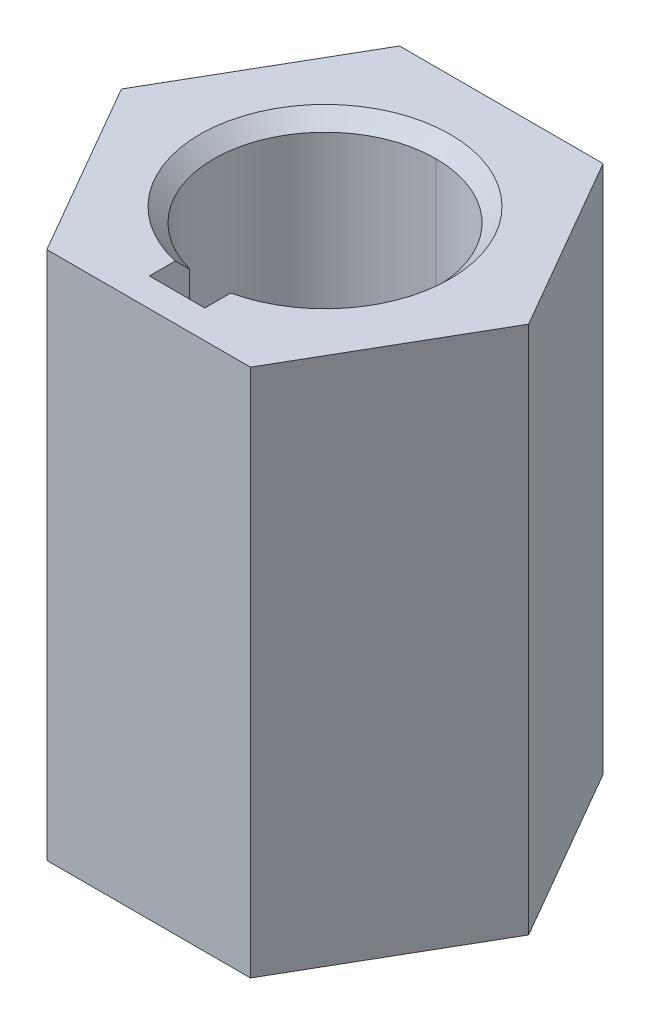
ISO-10303-21;
HEADER;
FILE_DESCRIPTION(('STEP AP214'),'2;1');
FILE_NAME('part.step','',(''),(''),'','','');
FILE_SCHEMA(('AUTOMOTIVE_DESIGN { 1 0 10303 214 1 1 1 1 }'));
ENDSEC;
DATA;
#1=APPLICATION_CONTEXT('core data for automotive mechanical design processes');
#2=APPLICATION_PROTOCOL_DEFINITION('international standard','automotive_design',2000,#1);
#3=PRODUCT_CONTEXT('',#1,'mechanical');
#4=PRODUCT('Part','Part','',(#3));
#5=PRODUCT_RELATED_PRODUCT_CATEGORY('part','',(#4));
#6=PRODUCT_DEFINITION_FORMATION('','',#4);
#7=PRODUCT_DEFINITION_CONTEXT('part definition',#1,'design');
#8=PRODUCT_DEFINITION('design','',#6,#7);
#9=PRODUCT_DEFINITION_SHAPE('','',#8);
#10=(LENGTH_UNIT() NAMED_UNIT(*) SI_UNIT(.MILLI.,.METRE.));
#11=(NAMED_UNIT(*) PLANE_ANGLE_UNIT() SI_UNIT($,.RADIAN.));
#12=(NAMED_UNIT(*) SI_UNIT($,.STERADIAN.) SOLID_ANGLE_UNIT());
#13=UNCERTAINTY_MEASURE_WITH_UNIT(LENGTH_MEASURE(1.E-05),#10,'distance_accuracy_value','');
#14=(GEOMETRIC_REPRESENTATION_CONTEXT(3) GLOBAL_UNCERTAINTY_ASSIGNED_CONTEXT((#13)) GLOBAL_UNIT_ASSIGNED_CONTEXT((#10,
#11,#12)) REPRESENTATION_CONTEXT('',''));
#15=CARTESIAN_POINT('',(0.,0.,0.));
#16=DIRECTION('',(0.,0.,1.));
#17=DIRECTION('',(1.,0.,0.));
#18=AXIS2_PLACEMENT_3D('',#15,#16,#17);
#19=CARTESIAN_POINT('',(0.,0.,0.));
#20=DIRECTION('',(0.,-1.,0.));
#21=DIRECTION('',(0.,0.,-1.));
#22=AXIS2_PLACEMENT_3D('',#19,#20,#21);
#23=CONICAL_SURFACE('',#22,4.508,0.785398163397443);
#24=CARTESIAN_POINT('',(0.,0.508,0.));
#25=DIRECTION('',(0.,-1.,0.));
#26=DIRECTION('',(0.,0.,1.));
#27=AXIS2_PLACEMENT_3D('',#24,#25,#26);
#28=CIRCLE('',#27,4.);
#29=CARTESIAN_POINT('',(0.,0.508,-4.));
#30=VERTEX_POINT('',#29);
#31=CARTESIAN_POINT('',(1.,0.508,3.87298334620742));
#32=VERTEX_POINT('',#31);
#33=EDGE_CURVE('E41',#30,#32,#28,.T.);
#34=ORIENTED_EDGE('',*,*,#33,.F.);
#35=DIRECTION('',(0.,-0.707106781186551,-0.707106781186544));
#36=VECTOR('',#35,1.);
#37=CARTESIAN_POINT('',(0.,0.,-4.508));
#38=LINE('',#37,#36);
#39=CARTESIAN_POINT('',(0.,0.,-4.508));
#40=VERTEX_POINT('',#39);
#41=EDGE_CURVE('E11',#30,#40,#38,.T.);
#42=ORIENTED_EDGE('',*,*,#41,.T.);
#43=CARTESIAN_POINT('',(0.,0.,0.));
#44=DIRECTION('',(0.,1.,0.));
#45=DIRECTION('',(0.,0.,1.));
#46=AXIS2_PLACEMENT_3D('',#43,#44,#45);
#47=CIRCLE('',#46,4.508);
#48=CARTESIAN_POINT('',(1.,0.,4.39568697702645));
#49=VERTEX_POINT('',#48);
#50=EDGE_CURVE('E220',#49,#40,#47,.T.);
#51=ORIENTED_EDGE('',*,*,#50,.F.);
#52=CARTESIAN_POINT('',(1.,0.508,3.87298334620742));
#53=CARTESIAN_POINT('',(1.,0.338992287878547,4.04753376072128));
#54=CARTESIAN_POINT('',(1.,0.169620782890584,4.22173225885223));
#55=CARTESIAN_POINT('',(1.,0.,4.39568697702645));
#56=(BOUNDED_CURVE() B_SPLINE_CURVE(3,(#52,#53,#54,#55),.UNSPECIFIED.,.F.,
.F.) B_SPLINE_CURVE_WITH_KNOTS((4,4),(0.,0.000728891683085627),
.UNSPECIFIED.) CURVE() GEOMETRIC_REPRESENTATION_ITEM() RATIONAL_B_SPLINE_CURVE((1.,1.,1.,1.)) REPRESENTATION_ITEM(''));
#57=EDGE_CURVE('E166',#32,#49,#56,.T.);
#58=ORIENTED_EDGE('',*,*,#57,.F.);
#59=EDGE_LOOP('',(#34,#42,#51,#58));
#60=FACE_BOUND('',#59,.T.);
#61=ADVANCED_FACE('F16',(#60),#23,.F.);
#62=CARTESIAN_POINT('',(0.,19.05,0.));
#63=DIRECTION('',(0.,-1.,0.));
#64=DIRECTION('',(0.,0.,-1.));
#65=AXIS2_PLACEMENT_3D('',#62,#63,#64);
#66=CYLINDRICAL_SURFACE('',#65,4.);
#67=CARTESIAN_POINT('',(0.,18.542,0.));
#68=DIRECTION('',(0.,1.,0.));
#69=DIRECTION('',(0.,0.,1.));
#70=AXIS2_PLACEMENT_3D('',#67,#68,#69);
#71=CIRCLE('',#70,4.);
#72=CARTESIAN_POINT('',(1.,18.542,3.87298334620742));
#73=VERTEX_POINT('',#72);
#74=CARTESIAN_POINT('',(0.,18.542,-4.));
#75=VERTEX_POINT('',#74);
#76=EDGE_CURVE('E27',#73,#75,#71,.T.);
#77=ORIENTED_EDGE('',*,*,#76,.T.);
#78=DIRECTION('',(0.,-1.,0.));
#79=VECTOR('',#78,1.);
#80=CARTESIAN_POINT('',(0.,19.05,-4.));
#81=LINE('',#80,#79);
#82=EDGE_CURVE('E177',#75,#30,#81,.T.);
#83=ORIENTED_EDGE('',*,*,#82,.T.);
#84=ORIENTED_EDGE('',*,*,#33,.T.);
#85=DIRECTION('',(0.,-1.,0.));
#86=VECTOR('',#85,1.);
#87=CARTESIAN_POINT('',(1.,19.05,3.87298334620742));
#88=LINE('',#87,#86);
#89=EDGE_CURVE('E159',#73,#32,#88,.T.);
#90=ORIENTED_EDGE('',*,*,#89,.F.);
#91=EDGE_LOOP('',(#77,#83,#84,#90));
#92=FACE_BOUND('',#91,.T.);
#93=ADVANCED_FACE('F18',(#92),#66,.F.);
#94=CARTESIAN_POINT('',(0.,19.05,0.));
#95=DIRECTION('',(0.,1.,0.));
#96=DIRECTION('',(1.,0.,0.));
#97=AXIS2_PLACEMENT_3D('',#94,#95,#96);
#98=PLANE('',#97);
#99=DIRECTION('',(0.499999999999991,0.,-0.866025403784444));
#100=VECTOR('',#99,1.);
#101=CARTESIAN_POINT('',(3.6661742093542,19.05,6.35));
#102=LINE('',#101,#100);
#103=CARTESIAN_POINT('',(3.6661742093542,19.05,6.35));
#104=VERTEX_POINT('',#103);
#105=CARTESIAN_POINT('',(7.33234841870825,19.05,0.));
#106=VERTEX_POINT('',#105);
#107=EDGE_CURVE('E204',#104,#106,#102,.T.);
#108=ORIENTED_EDGE('',*,*,#107,.T.);
#109=DIRECTION('',(-0.50000000000001,0.,-0.866025403784433));
#110=VECTOR('',#109,1.);
#111=CARTESIAN_POINT('',(7.33234841870825,19.05,0.));
#112=LINE('',#111,#110);
#113=CARTESIAN_POINT('',(3.66617420935405,19.05,-6.35));
#114=VERTEX_POINT('',#113);
#115=EDGE_CURVE('E236',#106,#114,#112,.T.);
#116=ORIENTED_EDGE('',*,*,#115,.T.);
#117=DIRECTION('',(-1.,0.,0.));
#118=VECTOR('',#117,1.);
#119=CARTESIAN_POINT('',(3.66617420935405,19.05,-6.35));
#120=LINE('',#119,#118);
#121=CARTESIAN_POINT('',(-3.66617420935419,19.05,-6.35));
#122=VERTEX_POINT('',#121);
#123=EDGE_CURVE('E233',#114,#122,#120,.T.);
#124=ORIENTED_EDGE('',*,*,#123,.T.);
#125=DIRECTION('',(-0.499999999999991,0.,0.866025403784444));
#126=VECTOR('',#125,1.);
#127=CARTESIAN_POINT('',(-3.66617420935419,19.05,-6.35));
#128=LINE('',#127,#126);
#129=CARTESIAN_POINT('',(-7.33234841870825,19.05,0.));
#130=VERTEX_POINT('',#129);
#131=EDGE_CURVE('E130',#122,#130,#128,.T.);
#132=ORIENTED_EDGE('',*,*,#131,.T.);
#133=DIRECTION('',(0.500000000000008,0.,0.866025403784434));
#134=VECTOR('',#133,1.);
#135=CARTESIAN_POINT('',(-7.33234841870825,19.05,0.));
#136=LINE('',#135,#134);
#137=CARTESIAN_POINT('',(-3.66617420935407,19.05,6.35));
#138=VERTEX_POINT('',#137);
#139=EDGE_CURVE('E141',#130,#138,#136,.T.);
#140=ORIENTED_EDGE('',*,*,#139,.T.);
#141=DIRECTION('',(1.,0.,0.));
#142=VECTOR('',#141,1.);
#143=CARTESIAN_POINT('',(-3.66617420935407,19.05,6.35));
#144=LINE('',#143,#142);
#145=EDGE_CURVE('E201',#138,#104,#144,.T.);
#146=ORIENTED_EDGE('',*,*,#145,.T.);
#147=EDGE_LOOP('',(#108,#116,#124,#132,#140,#146));
#148=FACE_BOUND('',#147,.T.);
#149=DIRECTION('',(0.,0.,1.));
#150=VECTOR('',#149,1.);
#151=CARTESIAN_POINT('',(-1.,19.05,5.32547116152768));
#152=LINE('',#151,#150);
#153=CARTESIAN_POINT('',(-1.,19.05,4.39568697702647));
#154=VERTEX_POINT('',#153);
#155=CARTESIAN_POINT('',(-1.,19.05,5.32547116152768));
#156=VERTEX_POINT('',#155);
#157=EDGE_CURVE('E291',#154,#156,#152,.T.);
#158=ORIENTED_EDGE('',*,*,#157,.F.);
#159=CARTESIAN_POINT('',(0.,19.05,0.));
#160=DIRECTION('',(0.,-1.,0.));
#161=DIRECTION('',(0.,0.,1.));
#162=AXIS2_PLACEMENT_3D('',#159,#160,#161);
#163=CIRCLE('',#162,4.508);
#164=CARTESIAN_POINT('',(1.,19.05,4.39568697702647));
#165=VERTEX_POINT('',#164);
#166=EDGE_CURVE('E228',#154,#165,#163,.T.);
#167=ORIENTED_EDGE('',*,*,#166,.T.);
#168=DIRECTION('',(0.,0.,-1.));
#169=VECTOR('',#168,1.);
#170=CARTESIAN_POINT('',(1.,19.05,3.87298334620742));
#171=LINE('',#170,#169);
#172=CARTESIAN_POINT('',(1.,19.05,5.32547116152768));
#173=VERTEX_POINT('',#172);
#174=EDGE_CURVE('E181',#173,#165,#171,.T.);
#175=ORIENTED_EDGE('',*,*,#174,.F.);
#176=DIRECTION('',(1.,0.,0.));
#177=VECTOR('',#176,1.);
#178=CARTESIAN_POINT('',(-1.,19.05,5.32547116152768));
#179=LINE('',#178,#177);
#180=EDGE_CURVE('E272',#156,#173,#179,.T.);
#181=ORIENTED_EDGE('',*,*,#180,.F.);
#182=EDGE_LOOP('',(#158,#167,#175,#181));
#183=FACE_BOUND('',#182,.T.);
#184=ADVANCED_FACE('F316',(#148,#183),#98,.T.);
#185=CARTESIAN_POINT('',(0.,0.,0.));
#186=DIRECTION('',(0.,1.,0.));
#187=DIRECTION('',(1.,0.,0.));
#188=AXIS2_PLACEMENT_3D('',#185,#186,#187);
#189=PLANE('',#188);
#190=DIRECTION('',(0.499999999999991,0.,-0.866025403784444));
#191=VECTOR('',#190,1.);
#192=CARTESIAN_POINT('',(3.6661742093542,0.,6.35));
#193=LINE('',#192,#191);
#194=CARTESIAN_POINT('',(3.6661742093542,0.,6.35));
#195=VERTEX_POINT('',#194);
#196=CARTESIAN_POINT('',(7.33234841870825,0.,0.));
#197=VERTEX_POINT('',#196);
#198=EDGE_CURVE('E219',#195,#197,#193,.T.);
#199=ORIENTED_EDGE('',*,*,#198,.F.);
#200=DIRECTION('',(1.,0.,0.));
#201=VECTOR('',#200,1.);
#202=CARTESIAN_POINT('',(-3.66617420935407,0.,6.35));
#203=LINE('',#202,#201);
#204=CARTESIAN_POINT('',(-3.66617420935407,0.,6.35));
#205=VERTEX_POINT('',#204);
#206=EDGE_CURVE('E254',#205,#195,#203,.T.);
#207=ORIENTED_EDGE('',*,*,#206,.F.);
#208=DIRECTION('',(0.500000000000008,0.,0.866025403784434));
#209=VECTOR('',#208,1.);
#210=CARTESIAN_POINT('',(-7.33234841870825,0.,0.));
#211=LINE('',#210,#209);
#212=CARTESIAN_POINT('',(-7.33234841870825,0.,0.));
#213=VERTEX_POINT('',#212);
#214=EDGE_CURVE('E253',#213,#205,#211,.T.);
#215=ORIENTED_EDGE('',*,*,#214,.F.);
#216=DIRECTION('',(-0.499999999999991,0.,0.866025403784444));
#217=VECTOR('',#216,1.);
#218=CARTESIAN_POINT('',(-3.66617420935419,0.,-6.35));
#219=LINE('',#218,#217);
#220=CARTESIAN_POINT('',(-3.66617420935419,0.,-6.35));
#221=VERTEX_POINT('',#220);
#222=EDGE_CURVE('E214',#221,#213,#219,.T.);
#223=ORIENTED_EDGE('',*,*,#222,.F.);
#224=DIRECTION('',(-1.,0.,0.));
#225=VECTOR('',#224,1.);
#226=CARTESIAN_POINT('',(3.66617420935405,0.,-6.35));
#227=LINE('',#226,#225);
#228=CARTESIAN_POINT('',(3.66617420935405,0.,-6.35));
#229=VERTEX_POINT('',#228);
#230=EDGE_CURVE('E209',#229,#221,#227,.T.);
#231=ORIENTED_EDGE('',*,*,#230,.F.);
#232=DIRECTION('',(-0.50000000000001,0.,-0.866025403784433));
#233=VECTOR('',#232,1.);
#234=CARTESIAN_POINT('',(7.33234841870825,0.,0.));
#235=LINE('',#234,#233);
#236=EDGE_CURVE('E20',#197,#229,#235,.T.);
#237=ORIENTED_EDGE('',*,*,#236,.F.);
#238=EDGE_LOOP('',(#199,#207,#215,#223,#231,#237));
#239=FACE_BOUND('',#238,.T.);
#240=DIRECTION('',(0.,0.,-1.));
#241=VECTOR('',#240,1.);
#242=CARTESIAN_POINT('',(1.,0.,3.87298334620742));
#243=LINE('',#242,#241);
#244=CARTESIAN_POINT('',(1.,0.,5.32547116152768));
#245=VERTEX_POINT('',#244);
#246=EDGE_CURVE('E223',#245,#49,#243,.T.);
#247=ORIENTED_EDGE('',*,*,#246,.T.);
#248=ORIENTED_EDGE('',*,*,#50,.T.);
#249=CARTESIAN_POINT('',(0.,0.,0.));
#250=DIRECTION('',(0.,1.,0.));
#251=DIRECTION('',(0.,0.,1.));
#252=AXIS2_PLACEMENT_3D('',#249,#250,#251);
#253=CIRCLE('',#252,4.508);
#254=CARTESIAN_POINT('',(-1.,0.,4.39568697702645));
#255=VERTEX_POINT('',#254);
#256=EDGE_CURVE('E224',#40,#255,#253,.T.);
#257=ORIENTED_EDGE('',*,*,#256,.T.);
#258=DIRECTION('',(0.,0.,1.));
#259=VECTOR('',#258,1.);
#260=CARTESIAN_POINT('',(-1.,0.,5.32547116152768));
#261=LINE('',#260,#259);
#262=CARTESIAN_POINT('',(-1.,0.,5.32547116152768));
#263=VERTEX_POINT('',#262);
#264=EDGE_CURVE('E231',#255,#263,#261,.T.);
#265=ORIENTED_EDGE('',*,*,#264,.T.);
#266=DIRECTION('',(1.,0.,0.));
#267=VECTOR('',#266,1.);
#268=CARTESIAN_POINT('',(-1.,0.,5.32547116152768));
#269=LINE('',#268,#267);
#270=EDGE_CURVE('E242',#263,#245,#269,.T.);
#271=ORIENTED_EDGE('',*,*,#270,.T.);
#272=EDGE_LOOP('',(#247,#248,#257,#265,#271));
#273=FACE_BOUND('',#272,.T.);
#274=ADVANCED_FACE('F520',(#239,#273),#189,.F.);
#275=CARTESIAN_POINT('',(3.6661742093542,19.05,6.35));
#276=DIRECTION('',(-0.866025403784444,0.,-0.499999999999991));
#277=DIRECTION('',(-0.499999999999991,0.,0.866025403784444));
#278=AXIS2_PLACEMENT_3D('',#275,#276,#277);
#279=PLANE('',#278);
#280=ORIENTED_EDGE('',*,*,#198,.T.);
#281=DIRECTION('',(0.,-1.,0.));
#282=VECTOR('',#281,1.);
#283=CARTESIAN_POINT('',(7.33234841870825,19.05,0.));
#284=LINE('',#283,#282);
#285=EDGE_CURVE('E205',#106,#197,#284,.T.);
#286=ORIENTED_EDGE('',*,*,#285,.F.);
#287=ORIENTED_EDGE('',*,*,#107,.F.);
#288=DIRECTION('',(0.,-1.,0.));
#289=VECTOR('',#288,1.);
#290=CARTESIAN_POINT('',(3.6661742093542,19.05,6.35));
#291=LINE('',#290,#289);
#292=EDGE_CURVE('E215',#104,#195,#291,.T.);
#293=ORIENTED_EDGE('',*,*,#292,.T.);
#294=EDGE_LOOP('',(#280,#286,#287,#293));
#295=FACE_BOUND('',#294,.T.);
#296=ADVANCED_FACE('F471',(#295),#279,.F.);
#297=CARTESIAN_POINT('',(7.33234841870825,19.05,0.));
#298=DIRECTION('',(-0.866025403784433,0.,0.500000000000009));
#299=DIRECTION('',(0.,1.,0.));
#300=AXIS2_PLACEMENT_3D('',#297,#298,#299);
#301=PLANE('',#300);
#302=ORIENTED_EDGE('',*,*,#236,.T.);
#303=DIRECTION('',(0.,-1.,0.));
#304=VECTOR('',#303,1.);
#305=CARTESIAN_POINT('',(3.66617420935405,19.05,-6.35));
#306=LINE('',#305,#304);
#307=EDGE_CURVE('E210',#114,#229,#306,.T.);
#308=ORIENTED_EDGE('',*,*,#307,.F.);
#309=ORIENTED_EDGE('',*,*,#115,.F.);
#310=ORIENTED_EDGE('',*,*,#285,.T.);
#311=EDGE_LOOP('',(#302,#308,#309,#310));
#312=FACE_BOUND('',#311,.T.);
#313=ADVANCED_FACE('F465',(#312),#301,.F.);
#314=CARTESIAN_POINT('',(3.66617420935405,19.05,-6.35));
#315=DIRECTION('',(0.,0.,1.));
#316=DIRECTION('',(1.,0.,0.));
#317=AXIS2_PLACEMENT_3D('',#314,#315,#316);
#318=PLANE('',#317);
#319=ORIENTED_EDGE('',*,*,#230,.T.);
#320=DIRECTION('',(0.,-1.,0.));
#321=VECTOR('',#320,1.);
#322=CARTESIAN_POINT('',(-3.66617420935419,19.05,-6.35));
#323=LINE('',#322,#321);
#324=EDGE_CURVE('E246',#122,#221,#323,.T.);
#325=ORIENTED_EDGE('',*,*,#324,.F.);
#326=ORIENTED_EDGE('',*,*,#123,.F.);
#327=ORIENTED_EDGE('',*,*,#307,.T.);
#328=EDGE_LOOP('',(#319,#325,#326,#327));
#329=FACE_BOUND('',#328,.T.);
#330=ADVANCED_FACE('F470',(#329),#318,.F.);
#331=CARTESIAN_POINT('',(-3.66617420935419,19.05,-6.35));
#332=DIRECTION('',(0.866025403784444,0.,0.499999999999991));
#333=DIRECTION('',(0.,-1.,0.));
#334=AXIS2_PLACEMENT_3D('',#331,#332,#333);
#335=PLANE('',#334);
#336=ORIENTED_EDGE('',*,*,#222,.T.);
#337=DIRECTION('',(0.,-1.,0.));
#338=VECTOR('',#337,1.);
#339=CARTESIAN_POINT('',(-7.33234841870825,19.05,0.));
#340=LINE('',#339,#338);
#341=EDGE_CURVE('E250',#130,#213,#340,.T.);
#342=ORIENTED_EDGE('',*,*,#341,.F.);
#343=ORIENTED_EDGE('',*,*,#131,.F.);
#344=ORIENTED_EDGE('',*,*,#324,.T.);
#345=EDGE_LOOP('',(#336,#342,#343,#344));
#346=FACE_BOUND('',#345,.T.);
#347=ADVANCED_FACE('F498',(#346),#335,.F.);
#348=CARTESIAN_POINT('',(-7.33234841870825,19.05,0.));
#349=DIRECTION('',(0.866025403784434,0.,-0.500000000000008));
#350=DIRECTION('',(0.,-1.,0.));
#351=AXIS2_PLACEMENT_3D('',#348,#349,#350);
#352=PLANE('',#351);
#353=ORIENTED_EDGE('',*,*,#214,.T.);
#354=DIRECTION('',(0.,-1.,0.));
#355=VECTOR('',#354,1.);
#356=CARTESIAN_POINT('',(-3.66617420935407,19.05,6.35));
#357=LINE('',#356,#355);
#358=EDGE_CURVE('E194',#138,#205,#357,.T.);
#359=ORIENTED_EDGE('',*,*,#358,.F.);
#360=ORIENTED_EDGE('',*,*,#139,.F.);
#361=ORIENTED_EDGE('',*,*,#341,.T.);
#362=EDGE_LOOP('',(#353,#359,#360,#361));
#363=FACE_BOUND('',#362,.T.);
#364=ADVANCED_FACE('F347',(#363),#352,.F.);
#365=CARTESIAN_POINT('',(-3.66617420935407,19.05,6.35));
#366=DIRECTION('',(0.,0.,-1.));
#367=DIRECTION('',(-1.,0.,0.));
#368=AXIS2_PLACEMENT_3D('',#365,#366,#367);
#369=PLANE('',#368);
#370=ORIENTED_EDGE('',*,*,#206,.T.);
#371=ORIENTED_EDGE('',*,*,#292,.F.);
#372=ORIENTED_EDGE('',*,*,#145,.F.);
#373=ORIENTED_EDGE('',*,*,#358,.T.);
#374=EDGE_LOOP('',(#370,#371,#372,#373));
#375=FACE_BOUND('',#374,.T.);
#376=ADVANCED_FACE('F345',(#375),#369,.F.);
#377=CARTESIAN_POINT('',(0.,19.05,0.));
#378=DIRECTION('',(0.,-1.,0.));
#379=DIRECTION('',(0.,0.,-1.));
#380=AXIS2_PLACEMENT_3D('',#377,#378,#379);
#381=CYLINDRICAL_SURFACE('',#380,4.);
#382=ORIENTED_EDGE('',*,*,#82,.F.);
#383=CARTESIAN_POINT('',(0.,18.542,0.));
#384=DIRECTION('',(0.,1.,0.));
#385=DIRECTION('',(0.,0.,1.));
#386=AXIS2_PLACEMENT_3D('',#383,#384,#385);
#387=CIRCLE('',#386,4.);
#388=CARTESIAN_POINT('',(-1.,18.542,3.87298334620742));
#389=VERTEX_POINT('',#388);
#390=EDGE_CURVE('E175',#75,#389,#387,.T.);
#391=ORIENTED_EDGE('',*,*,#390,.T.);
#392=DIRECTION('',(0.,-1.,0.));
#393=VECTOR('',#392,1.);
#394=CARTESIAN_POINT('',(-1.,19.05,3.87298334620742));
#395=LINE('',#394,#393);
#396=CARTESIAN_POINT('',(-1.,0.508,3.87298334620742));
#397=VERTEX_POINT('',#396);
#398=EDGE_CURVE('E286',#389,#397,#395,.T.);
#399=ORIENTED_EDGE('',*,*,#398,.T.);
#400=CARTESIAN_POINT('',(0.,0.508,0.));
#401=DIRECTION('',(0.,-1.,0.));
#402=DIRECTION('',(0.,0.,1.));
#403=AXIS2_PLACEMENT_3D('',#400,#401,#402);
#404=CIRCLE('',#403,4.);
#405=EDGE_CURVE('E261',#397,#30,#404,.T.);
#406=ORIENTED_EDGE('',*,*,#405,.T.);
#407=EDGE_LOOP('',(#382,#391,#399,#406));
#408=FACE_BOUND('',#407,.T.);
#409=ADVANCED_FACE('F481',(#408),#381,.F.);
#410=CARTESIAN_POINT('',(-1.,19.05,5.32547116152768));
#411=DIRECTION('',(1.,0.,0.));
#412=DIRECTION('',(0.,1.,0.));
#413=AXIS2_PLACEMENT_3D('',#410,#411,#412);
#414=PLANE('',#413);
#415=ORIENTED_EDGE('',*,*,#264,.F.);
#416=CARTESIAN_POINT('',(-1.,0.,4.39568697702645));
#417=CARTESIAN_POINT('',(-1.,0.169620782890584,4.22173225885223));
#418=CARTESIAN_POINT('',(-1.,0.338992287878547,4.04753376072128));
#419=CARTESIAN_POINT('',(-1.,0.508,3.87298334620742));
#420=(BOUNDED_CURVE() B_SPLINE_CURVE(3,(#416,#417,#418,#419),.UNSPECIFIED.,.F.,
.F.) B_SPLINE_CURVE_WITH_KNOTS((4,4),(0.,0.000728891683085632),
.UNSPECIFIED.) CURVE() GEOMETRIC_REPRESENTATION_ITEM() RATIONAL_B_SPLINE_CURVE((1.,1.,1.,1.)) REPRESENTATION_ITEM(''));
#421=EDGE_CURVE('E255',#255,#397,#420,.T.);
#422=ORIENTED_EDGE('',*,*,#421,.T.);
#423=ORIENTED_EDGE('',*,*,#398,.F.);
#424=CARTESIAN_POINT('',(-1.,18.542,3.87298334620742));
#425=CARTESIAN_POINT('',(-1.,18.7110077121215,4.04753376072129));
#426=CARTESIAN_POINT('',(-1.,18.8803792171094,4.22173225885224));
#427=CARTESIAN_POINT('',(-1.,19.05,4.39568697702647));
#428=(BOUNDED_CURVE() B_SPLINE_CURVE(3,(#424,#425,#426,#427),.UNSPECIFIED.,.F.,
.F.) B_SPLINE_CURVE_WITH_KNOTS((4,4),(0.,0.000728891683085654),
.UNSPECIFIED.) CURVE() GEOMETRIC_REPRESENTATION_ITEM() RATIONAL_B_SPLINE_CURVE((1.,1.,1.,1.)) REPRESENTATION_ITEM(''));
#429=EDGE_CURVE('E262',#389,#154,#428,.T.);
#430=ORIENTED_EDGE('',*,*,#429,.T.);
#431=ORIENTED_EDGE('',*,*,#157,.T.);
#432=DIRECTION('',(0.,-1.,0.));
#433=VECTOR('',#432,1.);
#434=CARTESIAN_POINT('',(-1.,19.05,5.32547116152768));
#435=LINE('',#434,#433);
#436=EDGE_CURVE('E279',#156,#263,#435,.T.);
#437=ORIENTED_EDGE('',*,*,#436,.T.);
#438=EDGE_LOOP('',(#415,#422,#423,#430,#431,#437));
#439=FACE_BOUND('',#438,.T.);
#440=ADVANCED_FACE('F307',(#439),#414,.T.);
#441=CARTESIAN_POINT('',(-1.,19.05,5.32547116152768));
#442=DIRECTION('',(0.,0.,-1.));
#443=DIRECTION('',(0.,-1.,0.));
#444=AXIS2_PLACEMENT_3D('',#441,#442,#443);
#445=PLANE('',#444);
#446=ORIENTED_EDGE('',*,*,#270,.F.);
#447=ORIENTED_EDGE('',*,*,#436,.F.);
#448=ORIENTED_EDGE('',*,*,#180,.T.);
#449=DIRECTION('',(0.,-1.,0.));
#450=VECTOR('',#449,1.);
#451=CARTESIAN_POINT('',(1.,19.05,5.32547116152768));
#452=LINE('',#451,#450);
#453=EDGE_CURVE('E165',#173,#245,#452,.T.);
#454=ORIENTED_EDGE('',*,*,#453,.T.);
#455=EDGE_LOOP('',(#446,#447,#448,#454));
#456=FACE_BOUND('',#455,.T.);
#457=ADVANCED_FACE('F311',(#456),#445,.T.);
#458=CARTESIAN_POINT('',(1.,19.05,3.87298334620742));
#459=DIRECTION('',(-1.,0.,0.));
#460=DIRECTION('',(0.,1.,0.));
#461=AXIS2_PLACEMENT_3D('',#458,#459,#460);
#462=PLANE('',#461);
#463=ORIENTED_EDGE('',*,*,#89,.T.);
#464=ORIENTED_EDGE('',*,*,#57,.T.);
#465=ORIENTED_EDGE('',*,*,#246,.F.);
#466=ORIENTED_EDGE('',*,*,#453,.F.);
#467=ORIENTED_EDGE('',*,*,#174,.T.);
#468=CARTESIAN_POINT('',(1.,19.05,4.39568697702647));
#469=CARTESIAN_POINT('',(1.,18.8803792171094,4.22173225885224));
#470=CARTESIAN_POINT('',(1.,18.7110077121215,4.04753376072129));
#471=CARTESIAN_POINT('',(1.,18.542,3.87298334620742));
#472=(BOUNDED_CURVE() B_SPLINE_CURVE(3,(#468,#469,#470,#471),.UNSPECIFIED.,.F.,
.F.) B_SPLINE_CURVE_WITH_KNOTS((4,4),(0.,0.000728891683085653),
.UNSPECIFIED.) CURVE() GEOMETRIC_REPRESENTATION_ITEM() RATIONAL_B_SPLINE_CURVE((1.,1.,1.,1.)) REPRESENTATION_ITEM(''));
#473=EDGE_CURVE('E172',#165,#73,#472,.T.);
#474=ORIENTED_EDGE('',*,*,#473,.T.);
#475=EDGE_LOOP('',(#463,#464,#465,#466,#467,#474));
#476=FACE_BOUND('',#475,.T.);
#477=ADVANCED_FACE('F179',(#476),#462,.T.);
#478=CARTESIAN_POINT('',(0.,0.,0.));
#479=DIRECTION('',(0.,-1.,0.));
#480=DIRECTION('',(0.,0.,-1.));
#481=AXIS2_PLACEMENT_3D('',#478,#479,#480);
#482=CONICAL_SURFACE('',#481,4.508,0.785398163397443);
#483=ORIENTED_EDGE('',*,*,#41,.F.);
#484=ORIENTED_EDGE('',*,*,#405,.F.);
#485=ORIENTED_EDGE('',*,*,#421,.F.);
#486=ORIENTED_EDGE('',*,*,#256,.F.);
#487=EDGE_LOOP('',(#483,#484,#485,#486));
#488=FACE_BOUND('',#487,.T.);
#489=ADVANCED_FACE('F455',(#488),#482,.F.);
#490=CARTESIAN_POINT('',(0.,18.542,0.));
#491=DIRECTION('',(0.,1.,0.));
#492=DIRECTION('',(0.,0.,1.));
#493=AXIS2_PLACEMENT_3D('',#490,#491,#492);
#494=CONICAL_SURFACE('',#493,4.,0.78539816339745);
#495=ORIENTED_EDGE('',*,*,#473,.F.);
#496=ORIENTED_EDGE('',*,*,#166,.F.);
#497=ORIENTED_EDGE('',*,*,#429,.F.);
#498=ORIENTED_EDGE('',*,*,#390,.F.);
#499=ORIENTED_EDGE('',*,*,#76,.F.);
#500=EDGE_LOOP('',(#495,#496,#497,#498,#499));
#501=FACE_BOUND('',#500,.T.);
#502=ADVANCED_FACE('F170',(#501),#494,.F.);
#503=CLOSED_SHELL('',(#61,#93,#184,#274,#296,#313,#330,#347,#364,#376,#409,#440,#457,#477,#489,#502));
#504=MANIFOLD_SOLID_BREP('B1',#503);
#505=ADVANCED_BREP_SHAPE_REPRESENTATION('',(#18,#504),#14);
#506=SHAPE_DEFINITION_REPRESENTATION(#9,#505);
ENDSEC;
END-ISO-10303-21;
